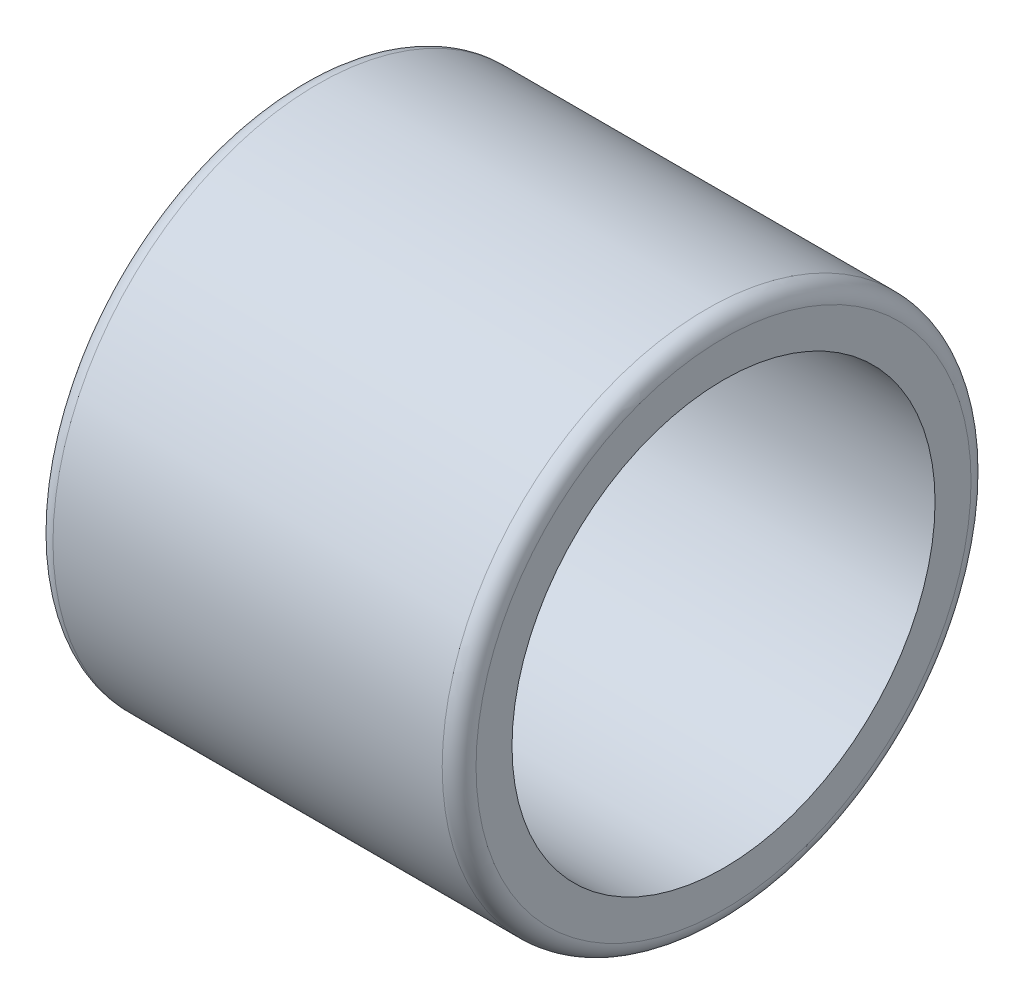
ISO-10303-21;
HEADER;
FILE_DESCRIPTION(('STEP AP214'),'2;1');
FILE_NAME('part.step','',(''),(''),'','','');
FILE_SCHEMA(('AUTOMOTIVE_DESIGN { 1 0 10303 214 1 1 1 1 }'));
ENDSEC;
DATA;
#1=APPLICATION_CONTEXT('core data for automotive mechanical design processes');
#2=APPLICATION_PROTOCOL_DEFINITION('international standard','automotive_design',2000,#1);
#3=PRODUCT_CONTEXT('',#1,'mechanical');
#4=PRODUCT('Part','Part','',(#3));
#5=PRODUCT_RELATED_PRODUCT_CATEGORY('part','',(#4));
#6=PRODUCT_DEFINITION_FORMATION('','',#4);
#7=PRODUCT_DEFINITION_CONTEXT('part definition',#1,'design');
#8=PRODUCT_DEFINITION('design','',#6,#7);
#9=PRODUCT_DEFINITION_SHAPE('','',#8);
#10=(LENGTH_UNIT() NAMED_UNIT(*) SI_UNIT(.MILLI.,.METRE.));
#11=(NAMED_UNIT(*) PLANE_ANGLE_UNIT() SI_UNIT($,.RADIAN.));
#12=(NAMED_UNIT(*) SI_UNIT($,.STERADIAN.) SOLID_ANGLE_UNIT());
#13=UNCERTAINTY_MEASURE_WITH_UNIT(LENGTH_MEASURE(1.E-05),#10,'distance_accuracy_value','');
#14=(GEOMETRIC_REPRESENTATION_CONTEXT(3) GLOBAL_UNCERTAINTY_ASSIGNED_CONTEXT((#13)) GLOBAL_UNIT_ASSIGNED_CONTEXT((#10,
#11,#12)) REPRESENTATION_CONTEXT('',''));
#15=CARTESIAN_POINT('',(0.,0.,0.));
#16=DIRECTION('',(0.,0.,1.));
#17=DIRECTION('',(1.,0.,0.));
#18=AXIS2_PLACEMENT_3D('',#15,#16,#17);
#19=CARTESIAN_POINT('',(6.35,-3.759378151,3.759327));
#20=DIRECTION('',(1.,0.,0.));
#21=DIRECTION('',(0.,0.,-1.));
#22=AXIS2_PLACEMENT_3D('',#19,#20,#21);
#23=PLANE('',#22);
#24=CARTESIAN_POINT('',(6.35,0.,0.));
#25=DIRECTION('',(-1.,0.,0.));
#26=DIRECTION('',(0.,0.,1.));
#27=AXIS2_PLACEMENT_3D('',#24,#25,#26);
#28=CIRCLE('',#27,3.175);
#29=CARTESIAN_POINT('',(6.35,0.,3.175));
#30=VERTEX_POINT('',#29);
#31=EDGE_CURVE('E67',#30,#30,#28,.F.);
#32=ORIENTED_EDGE('',*,*,#31,.F.);
#33=EDGE_LOOP('',(#32));
#34=FACE_BOUND('',#33,.T.);
#35=CARTESIAN_POINT('',(6.35,0.,0.));
#36=DIRECTION('',(1.,0.,0.));
#37=DIRECTION('',(0.,0.,-1.));
#38=AXIS2_PLACEMENT_3D('',#35,#36,#37);
#39=CIRCLE('',#38,3.71475);
#40=CARTESIAN_POINT('',(6.35,0.,-3.71475));
#41=VERTEX_POINT('',#40);
#42=EDGE_CURVE('E21',#41,#41,#39,.F.);
#43=ORIENTED_EDGE('',*,*,#42,.F.);
#44=EDGE_LOOP('',(#43));
#45=FACE_BOUND('',#44,.T.);
#46=ADVANCED_FACE('F16',(#34,#45),#23,.T.);
#47=CARTESIAN_POINT('',(6.096,0.,0.));
#48=DIRECTION('',(1.,0.,0.));
#49=DIRECTION('',(0.,0.,-1.));
#50=AXIS2_PLACEMENT_3D('',#47,#48,#49);
#51=TOROIDAL_SURFACE('',#50,3.71475,0.254000000000001);
#52=CARTESIAN_POINT('',(6.096,0.,0.));
#53=DIRECTION('',(-1.,0.,0.));
#54=DIRECTION('',(0.,0.,1.));
#55=AXIS2_PLACEMENT_3D('',#52,#53,#54);
#56=CIRCLE('',#55,3.96875);
#57=CARTESIAN_POINT('',(6.096,0.,3.96875));
#58=VERTEX_POINT('',#57);
#59=EDGE_CURVE('E36',#58,#58,#56,.F.);
#60=ORIENTED_EDGE('',*,*,#59,.T.);
#61=EDGE_LOOP('',(#60));
#62=FACE_BOUND('',#61,.T.);
#63=ORIENTED_EDGE('',*,*,#42,.T.);
#64=EDGE_LOOP('',(#63));
#65=FACE_BOUND('',#64,.T.);
#66=ADVANCED_FACE('F53',(#62,#65),#51,.T.);
#67=CARTESIAN_POINT('',(6.35,0.,0.));
#68=DIRECTION('',(-1.,0.,0.));
#69=DIRECTION('',(0.,0.,1.));
#70=AXIS2_PLACEMENT_3D('',#67,#68,#69);
#71=CYLINDRICAL_SURFACE('',#70,3.175);
#72=ORIENTED_EDGE('',*,*,#31,.T.);
#73=EDGE_LOOP('',(#72));
#74=FACE_BOUND('',#73,.T.);
#75=CARTESIAN_POINT('',(0.,0.,0.));
#76=DIRECTION('',(-1.,0.,0.));
#77=DIRECTION('',(0.,0.,1.));
#78=AXIS2_PLACEMENT_3D('',#75,#76,#77);
#79=CIRCLE('',#78,3.175);
#80=CARTESIAN_POINT('',(0.,0.,3.175));
#81=VERTEX_POINT('',#80);
#82=EDGE_CURVE('E35',#81,#81,#79,.T.);
#83=ORIENTED_EDGE('',*,*,#82,.T.);
#84=EDGE_LOOP('',(#83));
#85=FACE_BOUND('',#84,.T.);
#86=ADVANCED_FACE('F48',(#74,#85),#71,.F.);
#87=CARTESIAN_POINT('',(6.096,0.,0.));
#88=DIRECTION('',(-1.,0.,0.));
#89=DIRECTION('',(0.,0.,1.));
#90=AXIS2_PLACEMENT_3D('',#87,#88,#89);
#91=CYLINDRICAL_SURFACE('',#90,3.96875);
#92=ORIENTED_EDGE('',*,*,#59,.F.);
#93=EDGE_LOOP('',(#92));
#94=FACE_BOUND('',#93,.T.);
#95=CARTESIAN_POINT('',(0.254,0.,0.));
#96=DIRECTION('',(-1.,0.,0.));
#97=DIRECTION('',(0.,0.,1.));
#98=AXIS2_PLACEMENT_3D('',#95,#96,#97);
#99=CIRCLE('',#98,3.96875);
#100=CARTESIAN_POINT('',(0.254,0.,3.96875));
#101=VERTEX_POINT('',#100);
#102=EDGE_CURVE('E27',#101,#101,#99,.T.);
#103=ORIENTED_EDGE('',*,*,#102,.F.);
#104=EDGE_LOOP('',(#103));
#105=FACE_BOUND('',#104,.T.);
#106=ADVANCED_FACE('F40',(#94,#105),#91,.T.);
#107=CARTESIAN_POINT('',(0.,-3.759378151,3.759327));
#108=DIRECTION('',(1.,0.,0.));
#109=DIRECTION('',(0.,0.,-1.));
#110=AXIS2_PLACEMENT_3D('',#107,#108,#109);
#111=PLANE('',#110);
#112=ORIENTED_EDGE('',*,*,#82,.F.);
#113=EDGE_LOOP('',(#112));
#114=FACE_BOUND('',#113,.T.);
#115=CARTESIAN_POINT('',(0.,0.,0.));
#116=DIRECTION('',(1.,0.,0.));
#117=DIRECTION('',(0.,0.,-1.));
#118=AXIS2_PLACEMENT_3D('',#115,#116,#117);
#119=CIRCLE('',#118,3.71475);
#120=CARTESIAN_POINT('',(0.,0.,3.71474999907874));
#121=VERTEX_POINT('',#120);
#122=CARTESIAN_POINT('',(0.,0.,-3.71474999907874));
#123=VERTEX_POINT('',#122);
#124=EDGE_CURVE('E11',#121,#123,#119,.T.);
#125=ORIENTED_EDGE('',*,*,#124,.F.);
#126=CARTESIAN_POINT('',(0.,0.,-3.71474999815748));
#127=CARTESIAN_POINT('',(1.5220436902987E-11,0.0410702223330753,-3.7147385497249));
#128=CARTESIAN_POINT('',(8.12438632220122E-10,0.082140296577018,-3.71404600931855));
#129=CARTESIAN_POINT('',(3.66431614363843E-09,0.165505605889587,-3.71125810568088));
#130=CARTESIAN_POINT('',(5.757133081048E-09,0.207799414769107,-3.70911998455645));
#131=CARTESIAN_POINT('',(1.09259670066045E-08,0.293557749119954,-3.70331405267832));
#132=CARTESIAN_POINT('',(1.40296165058998E-08,0.337019299688143,-3.69960224278996));
#133=CARTESIAN_POINT('',(2.098516652139E-08,0.425049507261464,-3.69052092413767));
#134=CARTESIAN_POINT('',(2.48562402393576E-08,0.469613508864011,-3.68510625018989));
#135=CARTESIAN_POINT('',(3.31226006196796E-08,0.55977525677913,-3.67249011786837));
#136=CARTESIAN_POINT('',(3.75296290561091E-08,0.605366533742158,-3.66524239680286));
#137=CARTESIAN_POINT('',(4.66629150203459E-08,0.69749916887584,-3.6488308237617));
#138=CARTESIAN_POINT('',(5.13946217789468E-08,0.744032109844156,-3.63961969502845));
#139=CARTESIAN_POINT('',(6.09892146720835E-08,0.837953576978132,-3.61915239724493));
#140=CARTESIAN_POINT('',(6.58522174120755E-08,0.88533160430636,-3.60784803057181));
#141=CARTESIAN_POINT('',(7.55390191390909E-08,0.980837418071449,-3.58306661105128));
#142=CARTESIAN_POINT('',(8.03584808880803E-08,1.02895249122506,-3.56954054475506));
#143=CARTESIAN_POINT('',(8.98054012445839E-08,1.12581478223119,-3.54019023212862));
#144=CARTESIAN_POINT('',(9.44248560020745E-08,1.17454694139087,-3.52431627347318));
#145=CARTESIAN_POINT('',(1.03336676771921E-07,1.27251359181463,-3.49014780483882));
#146=CARTESIAN_POINT('',(1.07618084647101E-07,1.32173055082901,-3.47180301307912));
#147=CARTESIAN_POINT('',(1.15736497623213E-07,1.42052443770223,-3.43257467728092));
#148=CARTESIAN_POINT('',(1.19560235040627E-07,1.47008123547051,-3.41164042425854));
#149=CARTESIAN_POINT('',(1.26663831479295E-07,1.56939960057401,-3.36712026134239));
#150=CARTESIAN_POINT('',(1.2992869863274E-07,1.61913832068565,-3.34348337068063));
#151=CARTESIAN_POINT('',(1.35832971984521E-07,1.71865228717683,-3.29345152682285));
#152=CARTESIAN_POINT('',(1.38456194692155E-07,1.76840185610778,-3.26700548990921));
#153=CARTESIAN_POINT('',(1.43013540075636E-07,1.86775611296858,-3.21125672371434));
#154=CARTESIAN_POINT('',(1.4493077326484E-07,1.91733218761935,-3.18190299018147));
#155=CARTESIAN_POINT('',(1.48030487572343E-07,2.01614486389644,-3.1202493245161));
#156=CARTESIAN_POINT('',(1.49195816931655E-07,2.06534981965557,-3.0878986636625));
#157=CARTESIAN_POINT('',(1.50764098765936E-07,2.16321257119741,-3.02017217470137));
#158=CARTESIAN_POINT('',(1.51150043484318E-07,2.21183560204737,-2.9847461030752));
#159=CARTESIAN_POINT('',(1.51149993205999E-07,2.30831393396752,-2.91080183576648));
#160=CARTESIAN_POINT('',(1.50747507126718E-07,2.35613127633903,-2.87223410488623));
#161=CARTESIAN_POINT('',(1.49179126846251E-07,2.45076512487155,-2.79195310096715));
#162=CARTESIAN_POINT('',(1.47997600737354E-07,2.49754041720215,-2.75019123731621));
#163=CARTESIAN_POINT('',(1.44897794401689E-07,2.58984501431958,-2.66348366011066));
#164=CARTESIAN_POINT('',(1.42965056743398E-07,2.63532980371159,-2.61849054951925));
#165=CARTESIAN_POINT('',(1.38407629891795E-07,2.72479684915959,-2.52529888238491));
#166=CARTESIAN_POINT('',(1.35769948514035E-07,2.7687312584278,-2.47705438342409));
#167=CARTESIAN_POINT('',(1.29865608951154E-07,2.85483041761889,-2.37735669145162));
#168=CARTESIAN_POINT('',(1.26587692410721E-07,2.89694397771152,-2.32585928324793));
#169=CARTESIAN_POINT('',(1.19484047993319E-07,2.97912474492112,-2.2196724624469));
#170=CARTESIAN_POINT('',(1.156490440111E-07,3.01913742775049,-2.16494084406411));
#171=CARTESIAN_POINT('',(1.07530610924218E-07,3.09683130869388,-2.05232401631361));
#172=CARTESIAN_POINT('',(1.03240118330671E-07,3.13445467717929,-1.99439890510842));
#173=CARTESIAN_POINT('',(9.43282898740854E-08,3.20707796620447,-1.87545620070711));
#174=CARTESIAN_POINT('',(8.9702316099087E-08,3.24201680832027,-1.8144013003952));
#175=CARTESIAN_POINT('',(8.02554818607427E-08,3.30897299399405,-1.68928676935914));
#176=CARTESIAN_POINT('',(7.54326098848133E-08,3.34092607623193,-1.62519276739566));
#177=CARTESIAN_POINT('',(6.57456990084947E-08,3.40161166030712,-1.49410671856587));
#178=CARTESIAN_POINT('',(6.08824507138782E-08,3.43027686895027,-1.42708341635659));
#179=CARTESIAN_POINT('',(5.37179831477263E-08,3.47045328518584,-1.3249365717301));
#180=CARTESIAN_POINT('',(5.13365816390734E-08,3.48344993434808,-1.29039002409882));
#181=CARTESIAN_POINT('',(4.66305013395971E-08,3.50851605700523,-1.22062454010127));
#182=CARTESIAN_POINT('',(4.43064881046948E-08,3.52057657657064,-1.18540237497409));
#183=CARTESIAN_POINT('',(3.97398860809116E-08,3.54373189980524,-1.11430937387568));
#184=CARTESIAN_POINT('',(3.74981625226201E-08,3.5548175730708,-1.07843556692012));
#185=CARTESIAN_POINT('',(3.31218570015818E-08,3.5759857292173,-1.00606306060452));
#186=CARTESIAN_POINT('',(3.09883434803686E-08,3.58605891872118,-0.969561642009764));
#187=CARTESIAN_POINT('',(2.68553598609022E-08,3.60516468048273,-0.895960103800567));
#188=CARTESIAN_POINT('',(2.48571662548843E-08,3.6141878008855,-0.858857530636529));
#189=CARTESIAN_POINT('',(2.10228632755604E-08,3.63115642993164,-0.78408168669793));
#190=CARTESIAN_POINT('',(1.91882427436916E-08,3.63909233579293,-0.746406236525646));
#191=CARTESIAN_POINT('',(1.57102781122932E-08,3.6538499814889,-0.670514648142521));
#192=CARTESIAN_POINT('',(1.40686394629938E-08,3.66066197498095,-0.632296614477696));
#193=CARTESIAN_POINT('',(1.10069795731295E-08,3.67313579748377,-0.555351858545309));
#194=CARTESIAN_POINT('',(9.58888449079883E-09,3.67878774466376,-0.516623534106004));
#195=CARTESIAN_POINT('',(7.00580030874653E-09,3.68890611764875,-0.438692185940276));
#196=CARTESIAN_POINT('',(5.84296203226824E-09,3.69336253464207,-0.399487862360519));
#197=CARTESIAN_POINT('',(3.80303568533047E-09,3.7010552473994,-0.320640622646968));
#198=CARTESIAN_POINT('',(2.9283269980849E-09,3.70428141653515,-0.280996718752385));
#199=CARTESIAN_POINT('',(1.49842931142024E-09,3.70947983524627,-0.201308113426923));
#200=CARTESIAN_POINT('',(9.45851783127166E-10,3.71144184960416,-0.161262742358259));
#201=CARTESIAN_POINT('',(1.95226798865813E-10,3.71407928156576,-0.0808123546853858));
#202=CARTESIAN_POINT('',(0.,3.71474436683385,-0.0404070056471017));
#203=CARTESIAN_POINT('',(0.,3.71475847733096,0.0607806191015419));
#204=CARTESIAN_POINT('',(4.41524581080298E-10,3.71327484895441,0.121564986524901));
#205=CARTESIAN_POINT('',(2.04692111819592E-09,3.70732619463926,0.242986164632792));
#206=CARTESIAN_POINT('',(3.21075697041581E-09,3.70286114917876,0.303622974348527));
#207=CARTESIAN_POINT('',(6.11063680892733E-09,3.69096058929311,0.424605278121542));
#208=CARTESIAN_POINT('',(7.84668429214064E-09,3.68352505671454,0.484950770396225));
#209=CARTESIAN_POINT('',(1.17511465725988E-08,3.66570135392076,0.605204335593609));
#210=CARTESIAN_POINT('',(1.39195638233813E-08,3.65531316695018,0.665112406032104));
#211=CARTESIAN_POINT('',(1.85593186163282E-08,3.63160917624652,0.784346892825348));
#212=CARTESIAN_POINT('',(2.10306577452009E-08,3.61829335717817,0.843673306131611));
#213=CARTESIAN_POINT('',(2.61571555383973E-08,3.58876616407508,0.9616014261763));
#214=CARTESIAN_POINT('',(2.88123150853079E-08,3.57255477613709,1.02020312943354));
#215=CARTESIAN_POINT('',(3.41977120597847E-08,3.53727549442619,1.13654058145776));
#216=CARTESIAN_POINT('',(3.69279498150261E-08,3.51820758818452,1.19427632644361));
#217=CARTESIAN_POINT('',(4.23651172525819E-08,3.47726120586695,1.30874268500786));
#218=CARTESIAN_POINT('',(4.50720468432858E-08,3.45538271874969,1.36547329463662));
#219=CARTESIAN_POINT('',(5.03745685459727E-08,3.40886788850904,1.47779263221445));
#220=CARTESIAN_POINT('',(5.29701602691231E-08,3.38423153575525,1.5333813561753));
#221=CARTESIAN_POINT('',(5.79723331484811E-08,3.33226033834396,1.64328292333863));
#222=CARTESIAN_POINT('',(6.03789137271317E-08,3.3049254854413,1.69759576264207));
#223=CARTESIAN_POINT('',(6.49357478109407E-08,3.24762315908529,1.80481463728065));
#224=CARTESIAN_POINT('',(6.70860006447524E-08,3.21765567873721,1.85772066893095));
#225=CARTESIAN_POINT('',(7.10732190028857E-08,3.15516031721234,1.96199839636532));
#226=CARTESIAN_POINT('',(7.29101838434412E-08,3.12263243044758,2.01337008880041));
#227=CARTESIAN_POINT('',(7.62242225524424E-08,3.05509465002041,2.11445530496586));
#228=CARTESIAN_POINT('',(7.77012957925105E-08,3.02008475202451,2.16416882580088));
#229=CARTESIAN_POINT('',(8.02593040430105E-08,2.94766732820491,2.26181786368013));
#230=CARTESIAN_POINT('',(8.13402385346988E-08,2.91025979924158,2.30975337839598));
#231=CARTESIAN_POINT('',(8.30800785624331E-08,2.8331372741853,2.40373085578584));
#232=CARTESIAN_POINT('',(8.3738983730053E-08,2.79342227607799,2.44977281680677));
#233=CARTESIAN_POINT('',(8.46192307675345E-08,2.71178053759717,2.53985220412081));
#234=CARTESIAN_POINT('',(8.48405724464093E-08,2.66985379625831,2.58388962953897));
#235=CARTESIAN_POINT('',(8.48405147683796E-08,2.5838896294533,2.669853796243));
#236=CARTESIAN_POINT('',(8.46191154114882E-08,2.53985220398723,2.71178053752893));
#237=CARTESIAN_POINT('',(8.37387544182796E-08,2.44977281658265,2.79342227589912));
#238=CARTESIAN_POINT('',(8.30797929729743E-08,2.40373085551921,2.83313727394888));
#239=CARTESIAN_POINT('',(8.13398430284523E-08,2.30975337804985,2.91025979888565));
#240=CARTESIAN_POINT('',(8.02588548976844E-08,2.26181786329714,2.94766732778715));
#241=CARTESIAN_POINT('',(7.77007434604332E-08,2.16416882535036,3.02008475147936));
#242=CARTESIAN_POINT('',(7.62236206727118E-08,2.11445530448478,3.05509464940983));
#243=CARTESIAN_POINT('',(7.29094882586118E-08,2.01337008826341,3.12263242970196));
#244=CARTESIAN_POINT('',(7.10724792606227E-08,1.96199839580306,3.15516031639727));
#245=CARTESIAN_POINT('',(6.70851793529344E-08,1.85772066832838,3.21765567778281));
#246=CARTESIAN_POINT('',(6.49348891270051E-08,1.80481463666311,3.24762315806116));
#247=CARTESIAN_POINT('',(6.03779883566146E-08,1.69759576198736,3.30492548426551));
#248=CARTESIAN_POINT('',(5.7971378483494E-08,1.64328292266181,3.3322603370864));
#249=CARTESIAN_POINT('',(5.29691565399491E-08,1.53338135551308,3.38423153436821));
#250=CARTESIAN_POINT('',(5.03735450470637E-08,1.47779263158901,3.40886788707447));
#251=CARTESIAN_POINT('',(4.50709944205025E-08,1.36547329389799,3.45538271708375));
#252=CARTESIAN_POINT('',(4.2364055675629E-08,1.30874268411933,3.47726120401733));
#253=CARTESIAN_POINT('',(3.69268827780255E-08,1.19427632598568,3.51820758646955));
#254=CARTESIAN_POINT('',(3.41966487168569E-08,1.13654058158041,3.5372754930297));
#255=CARTESIAN_POINT('',(2.88112700888104E-08,1.02020312802541,3.57255477349991));
#256=CARTESIAN_POINT('',(2.61561251942047E-08,0.961601422656888,3.5887661598789));
#257=CARTESIAN_POINT('',(2.10296810143547E-08,0.843673308470339,3.61829335686977));
#258=CARTESIAN_POINT('',(1.85583808463957E-08,0.784346903133491,3.63160918138503));
#259=CARTESIAN_POINT('',(1.39186852293965E-08,0.665112394692297,3.65531315683764));
#260=CARTESIAN_POINT('',(1.17502881937283E-08,0.605204294636666,3.66570132311056));
#261=CARTESIAN_POINT('',(7.84601416236978E-09,0.484950810514371,3.68352508208567));
#262=CARTESIAN_POINT('',(6.11013471227743E-09,0.424605428931145,3.69096069154283));
#263=CARTESIAN_POINT('',(3.21012379945723E-09,0.303622822938495,3.70286104103384));
#264=CARTESIAN_POINT('',(2.04598884262871E-09,0.242985600314886,3.7073257992235));
#265=CARTESIAN_POINT('',(4.41828449068743E-10,0.121565550518672,3.71327523802597));
#266=CARTESIAN_POINT('',(1.798270962839E-12,0.0607827243020753,3.71475993815196));
#267=CARTESIAN_POINT('',(0.,0.,3.71474999815748));
#268=B_SPLINE_CURVE_WITH_KNOTS('',3,(#126,#127,#128,#129,#130,#131,#132,#133,#134,#135,#136,
#137,#138,#139,#140,#141,#142,#143,#144,#145,#146,#147,#148,#149,#150,#151,#152,#153,#154,#155,
#156,#157,#158,#159,#160,#161,#162,#163,#164,#165,#166,#167,#168,#169,#170,#171,#172,#173,#174,
#175,#176,#177,#178,#179,#180,#181,#182,#183,#184,#185,#186,#187,#188,#189,#190,#191,#192,#193,
#194,#195,#196,#197,#198,#199,#200,#201,#202,#203,#204,#205,#206,#207,#208,#209,#210,#211,#212,
#213,#214,#215,#216,#217,#218,#219,#220,#221,#222,#223,#224,#225,#226,#227,#228,#229,#230,#231,
#232,#233,#234,#235,#236,#237,#238,#239,#240,#241,#242,#243,#244,#245,#246,#247,#248,#249,#250,
#251,#252,#253,#254,#255,#256,#257,#258,#259,#260,#261,#262,#263,#264,#265,#266,#267),
.UNSPECIFIED.,.F.,.F.,(4,2,2,2,2,2,2,2,2,2,2,2,2,2,2,2,2,2,2,2,2,2,2,2,2,2,2,2,2,2,2,2,2,2,2,2,
2,2,2,2,2,2,2,2,2,2,2,2,2,2,2,2,2,2,2,2,2,2,2,2,2,2,2,2,2,2,2,2,2,2,4),(0.,0.123205187075331,
0.250223929176914,0.38105620243993,0.515701988657182,0.654161275279721,0.796434055417371,
0.942520327839176,1.09242009697376,1.24613337290965,1.40366017139549,1.56500051384028,
1.73015442731354,1.89912194454538,2.07190310392667,2.24849794950904,2.42890653100496,
2.61312890378771,2.80116512889142,2.99301527301101,3.18867940850217,3.38815761338127,
3.59144997132531,3.7985565716718,4.0094775094187,4.22421288522425,4.44276280540686,
4.55348054620541,4.66515228605198,4.77777804535287,4.89135784491543,5.00589170594809,
5.12137965006032,5.23782169926267,5.35521787596671,5.47356820298511,5.59287270353157,
5.71313140122084,5.83434432006873,6.01667399614084,6.19900486609343,6.38133685033408,
6.56366986927039,6.74600384330995,6.92833869286036,7.11067433832919,7.29301070012405,
7.47534769865254,7.65768525432226,7.84002328754083,8.02236171871586,8.20470046825497,
8.3870394565658,8.56937860405596,8.7517178311331,8.93405705820484,9.11639620567882,
9.29873519396267,9.48107394346403,9.6634123745905,9.84575040774973,10.0280879633493,
10.2104249617969,10.3927613235,10.5750969688664,10.7574318183035,10.939765792219,
11.1220988110204,11.3044307951154,11.4867616649116,11.6690913408164),.UNSPECIFIED.);
#269=EDGE_CURVE('E33',#123,#121,#268,.T.);
#270=ORIENTED_EDGE('',*,*,#269,.F.);
#271=EDGE_LOOP('',(#125,#270));
#272=FACE_BOUND('',#271,.T.);
#273=ADVANCED_FACE('F38',(#114,#272),#111,.F.);
#274=CARTESIAN_POINT('',(0.254,0.,0.));
#275=DIRECTION('',(1.,0.,0.));
#276=DIRECTION('',(0.,0.,-1.));
#277=AXIS2_PLACEMENT_3D('',#274,#275,#276);
#278=TOROIDAL_SURFACE('',#277,3.71475,0.254);
#279=ORIENTED_EDGE('',*,*,#102,.T.);
#280=EDGE_LOOP('',(#279));
#281=FACE_BOUND('',#280,.T.);
#282=ORIENTED_EDGE('',*,*,#124,.T.);
#283=ORIENTED_EDGE('',*,*,#269,.T.);
#284=EDGE_LOOP('',(#282,#283));
#285=FACE_BOUND('',#284,.T.);
#286=ADVANCED_FACE('F18',(#281,#285),#278,.T.);
#287=CLOSED_SHELL('',(#46,#66,#86,#106,#273,#286));
#288=MANIFOLD_SOLID_BREP('B1',#287);
#289=ADVANCED_BREP_SHAPE_REPRESENTATION('',(#18,#288),#14);
#290=SHAPE_DEFINITION_REPRESENTATION(#9,#289);
ENDSEC;
END-ISO-10303-21;
